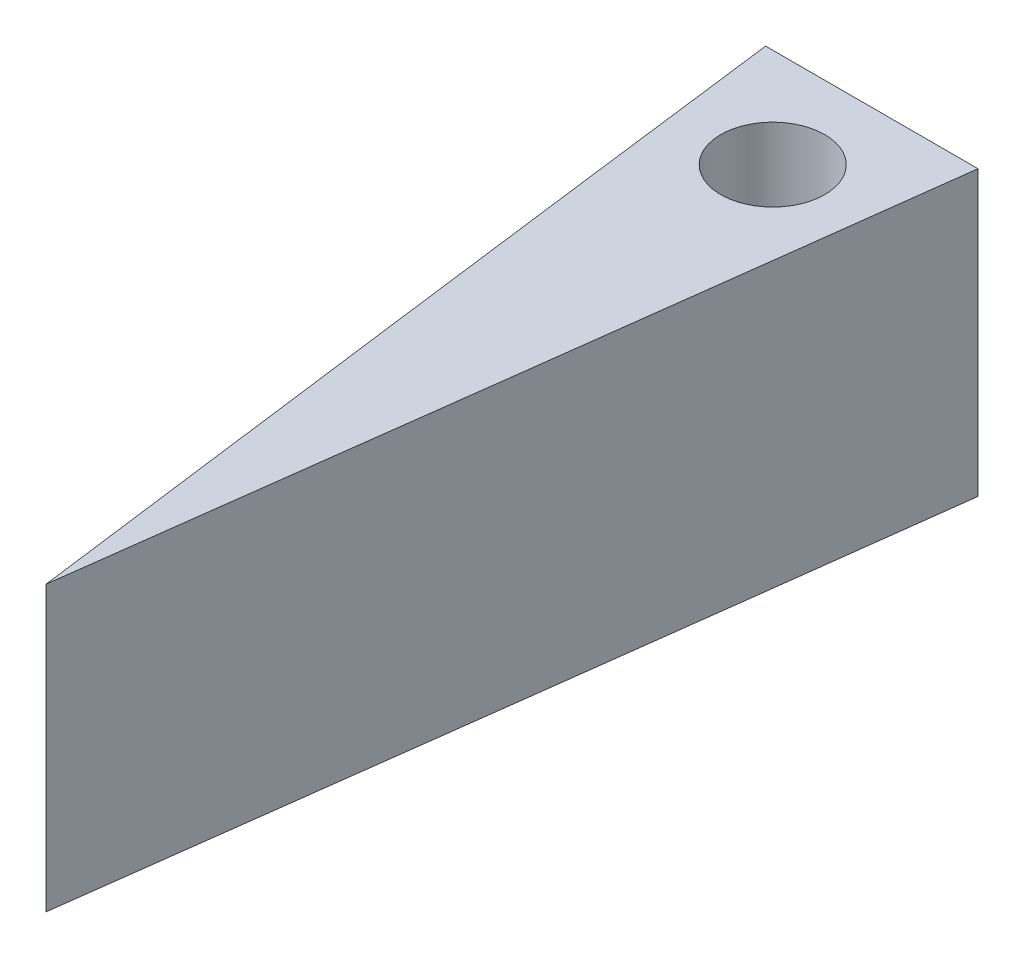
ISO-10303-21;
HEADER;
FILE_DESCRIPTION(('STEP AP214'),'2;1');
FILE_NAME('part.step','',(''),(''),'','','');
FILE_SCHEMA(('AUTOMOTIVE_DESIGN { 1 0 10303 214 1 1 1 1 }'));
ENDSEC;
DATA;
#1=APPLICATION_CONTEXT('core data for automotive mechanical design processes');
#2=APPLICATION_PROTOCOL_DEFINITION('international standard','automotive_design',2000,#1);
#3=PRODUCT_CONTEXT('',#1,'mechanical');
#4=PRODUCT('Part','Part','',(#3));
#5=PRODUCT_RELATED_PRODUCT_CATEGORY('part','',(#4));
#6=PRODUCT_DEFINITION_FORMATION('','',#4);
#7=PRODUCT_DEFINITION_CONTEXT('part definition',#1,'design');
#8=PRODUCT_DEFINITION('design','',#6,#7);
#9=PRODUCT_DEFINITION_SHAPE('','',#8);
#10=(LENGTH_UNIT() NAMED_UNIT(*) SI_UNIT(.MILLI.,.METRE.));
#11=(NAMED_UNIT(*) PLANE_ANGLE_UNIT() SI_UNIT($,.RADIAN.));
#12=(NAMED_UNIT(*) SI_UNIT($,.STERADIAN.) SOLID_ANGLE_UNIT());
#13=UNCERTAINTY_MEASURE_WITH_UNIT(LENGTH_MEASURE(1.E-05),#10,'distance_accuracy_value','');
#14=(GEOMETRIC_REPRESENTATION_CONTEXT(3) GLOBAL_UNCERTAINTY_ASSIGNED_CONTEXT((#13)) GLOBAL_UNIT_ASSIGNED_CONTEXT((#10,
#11,#12)) REPRESENTATION_CONTEXT('',''));
#15=CARTESIAN_POINT('',(0.,0.,0.));
#16=DIRECTION('',(0.,0.,1.));
#17=DIRECTION('',(1.,0.,0.));
#18=AXIS2_PLACEMENT_3D('',#15,#16,#17);
#19=CARTESIAN_POINT('',(1.10809611059364,169.87266,71.9337783562964));
#20=DIRECTION('',(0.,-1.,0.));
#21=DIRECTION('',(0.,0.,-1.));
#22=AXIS2_PLACEMENT_3D('',#19,#20,#21);
#23=CYLINDRICAL_SURFACE('',#22,2.);
#24=CARTESIAN_POINT('',(1.10809611059364,154.195082355691,71.9337783562964));
#25=DIRECTION('',(0.,1.,0.));
#26=DIRECTION('',(0.,0.,1.));
#27=AXIS2_PLACEMENT_3D('',#24,#25,#26);
#28=CIRCLE('',#27,2.);
#29=CARTESIAN_POINT('',(1.10809611059364,154.195082355691,69.9337783562964));
#30=VERTEX_POINT('',#29);
#31=EDGE_CURVE('E88',#30,#30,#28,.F.);
#32=CARTESIAN_POINT('',(1.10809611059364,165.106922355691,71.9337783562964));
#33=DIRECTION('',(0.,-1.,0.));
#34=DIRECTION('',(0.,0.,-1.));
#35=AXIS2_PLACEMENT_3D('',#32,#33,#34);
#36=CIRCLE('',#35,2.);
#37=CARTESIAN_POINT('',(1.10809611059364,165.106922355691,69.9337783562964));
#38=VERTEX_POINT('',#37);
#39=EDGE_CURVE('E171',#38,#38,#36,.F.);
#40=CARTESIAN_POINT('',(1.10809611059364,154.195082355691,69.9337783562964));
#41=CARTESIAN_POINT('',(1.10809611059364,154.308747355691,69.9337783562964));
#42=CARTESIAN_POINT('',(1.10809611059364,154.422412355691,69.9337783562964));
#43=CARTESIAN_POINT('',(1.10809611059364,154.649742355691,69.9337783562964));
#44=CARTESIAN_POINT('',(1.10809611059364,154.763407355691,69.9337783562964));
#45=CARTESIAN_POINT('',(1.10809611059364,154.990737355691,69.9337783562964));
#46=CARTESIAN_POINT('',(1.10809611059364,155.104402355691,69.9337783562964));
#47=CARTESIAN_POINT('',(1.10809611059364,155.331732355691,69.9337783562964));
#48=CARTESIAN_POINT('',(1.10809611059364,155.445397355691,69.9337783562964));
#49=CARTESIAN_POINT('',(1.10809611059364,155.672727355691,69.9337783562964));
#50=CARTESIAN_POINT('',(1.10809611059364,155.786392355691,69.9337783562964));
#51=CARTESIAN_POINT('',(1.10809611059364,156.013722355691,69.9337783562964));
#52=CARTESIAN_POINT('',(1.10809611059364,156.127387355691,69.9337783562964));
#53=CARTESIAN_POINT('',(1.10809611059364,156.354717355691,69.9337783562964));
#54=CARTESIAN_POINT('',(1.10809611059364,156.468382355691,69.9337783562964));
#55=CARTESIAN_POINT('',(1.10809611059364,156.695712355691,69.9337783562964));
#56=CARTESIAN_POINT('',(1.10809611059364,156.809377355691,69.9337783562964));
#57=CARTESIAN_POINT('',(1.10809611059364,157.036707355691,69.9337783562964));
#58=CARTESIAN_POINT('',(1.10809611059364,157.150372355691,69.9337783562964));
#59=CARTESIAN_POINT('',(1.10809611059364,157.377702355691,69.9337783562964));
#60=CARTESIAN_POINT('',(1.10809611059364,157.491367355691,69.9337783562964));
#61=CARTESIAN_POINT('',(1.10809611059364,157.718697355691,69.9337783562964));
#62=CARTESIAN_POINT('',(1.10809611059364,157.832362355691,69.9337783562964));
#63=CARTESIAN_POINT('',(1.10809611059364,158.059692355691,69.9337783562964));
#64=CARTESIAN_POINT('',(1.10809611059364,158.173357355691,69.9337783562964));
#65=CARTESIAN_POINT('',(1.10809611059364,158.400687355691,69.9337783562964));
#66=CARTESIAN_POINT('',(1.10809611059364,158.514352355691,69.9337783562964));
#67=CARTESIAN_POINT('',(1.10809611059364,158.741682355691,69.9337783562964));
#68=CARTESIAN_POINT('',(1.10809611059364,158.855347355691,69.9337783562964));
#69=CARTESIAN_POINT('',(1.10809611059364,159.082677355691,69.9337783562964));
#70=CARTESIAN_POINT('',(1.10809611059364,159.196342355691,69.9337783562964));
#71=CARTESIAN_POINT('',(1.10809611059364,159.423672355691,69.9337783562964));
#72=CARTESIAN_POINT('',(1.10809611059364,159.537337355691,69.9337783562964));
#73=CARTESIAN_POINT('',(1.10809611059364,159.764667355691,69.9337783562964));
#74=CARTESIAN_POINT('',(1.10809611059364,159.878332355691,69.9337783562964));
#75=CARTESIAN_POINT('',(1.10809611059364,160.105662355691,69.9337783562964));
#76=CARTESIAN_POINT('',(1.10809611059364,160.219327355691,69.9337783562964));
#77=CARTESIAN_POINT('',(1.10809611059364,160.446657355691,69.9337783562964));
#78=CARTESIAN_POINT('',(1.10809611059364,160.560322355691,69.9337783562964));
#79=CARTESIAN_POINT('',(1.10809611059364,160.787652355691,69.9337783562964));
#80=CARTESIAN_POINT('',(1.10809611059364,160.901317355691,69.9337783562964));
#81=CARTESIAN_POINT('',(1.10809611059364,161.128647355691,69.9337783562964));
#82=CARTESIAN_POINT('',(1.10809611059364,161.242312355691,69.9337783562964));
#83=CARTESIAN_POINT('',(1.10809611059364,161.469642355691,69.9337783562964));
#84=CARTESIAN_POINT('',(1.10809611059364,161.583307355691,69.9337783562964));
#85=CARTESIAN_POINT('',(1.10809611059364,161.810637355691,69.9337783562964));
#86=CARTESIAN_POINT('',(1.10809611059364,161.924302355691,69.9337783562964));
#87=CARTESIAN_POINT('',(1.10809611059364,162.151632355691,69.9337783562964));
#88=CARTESIAN_POINT('',(1.10809611059364,162.265297355691,69.9337783562964));
#89=CARTESIAN_POINT('',(1.10809611059364,162.492627355691,69.9337783562964));
#90=CARTESIAN_POINT('',(1.10809611059364,162.606292355691,69.9337783562964));
#91=CARTESIAN_POINT('',(1.10809611059364,162.833622355691,69.9337783562964));
#92=CARTESIAN_POINT('',(1.10809611059364,162.947287355691,69.9337783562964));
#93=CARTESIAN_POINT('',(1.10809611059364,163.174617355691,69.9337783562964));
#94=CARTESIAN_POINT('',(1.10809611059364,163.288282355691,69.9337783562964));
#95=CARTESIAN_POINT('',(1.10809611059364,163.515612355691,69.9337783562964));
#96=CARTESIAN_POINT('',(1.10809611059364,163.629277355691,69.9337783562964));
#97=CARTESIAN_POINT('',(1.10809611059364,163.856607355691,69.9337783562964));
#98=CARTESIAN_POINT('',(1.10809611059364,163.970272355691,69.9337783562964));
#99=CARTESIAN_POINT('',(1.10809611059364,164.197602355691,69.9337783562964));
#100=CARTESIAN_POINT('',(1.10809611059364,164.311267355691,69.9337783562964));
#101=CARTESIAN_POINT('',(1.10809611059364,164.538597355691,69.9337783562964));
#102=CARTESIAN_POINT('',(1.10809611059364,164.652262355691,69.9337783562964));
#103=CARTESIAN_POINT('',(1.10809611059364,164.879592355691,69.9337783562964));
#104=CARTESIAN_POINT('',(1.10809611059364,164.993257355691,69.9337783562964));
#105=CARTESIAN_POINT('',(1.10809611059364,165.106922355691,69.9337783562964));
#106=B_SPLINE_CURVE_WITH_KNOTS('',3,(#40,#41,#42,#43,#44,#45,#46,#47,#48,#49,#50,#51,#52,#53,
#54,#55,#56,#57,#58,#59,#60,#61,#62,#63,#64,#65,#66,#67,#68,#69,#70,#71,#72,#73,#74,#75,#76,#77,
#78,#79,#80,#81,#82,#83,#84,#85,#86,#87,#88,#89,#90,#91,#92,#93,#94,#95,#96,#97,#98,#99,#100,
#101,#102,#103,#104,#105),.UNSPECIFIED.,.F.,.F.,(4,2,2,2,2,2,2,2,2,2,2,2,2,2,2,2,2,2,2,2,2,2,2,
2,2,2,2,2,2,2,2,2,4),(0.,0.340995000000011,0.681990000000021,1.022985,1.36398000000001,
1.70497500000003,2.04597000000001,2.38696500000002,2.72796000000003,3.06895500000001,
3.40995000000002,3.75094500000003,4.09194000000002,4.43293500000003,4.77393000000004,
5.11492500000002,5.45592000000003,5.79691500000004,6.13791000000002,6.47890500000003,
6.81990000000004,7.16089500000003,7.50189000000004,7.84288500000005,8.18388000000003,
8.52487500000004,8.86587000000005,9.20686500000004,9.54786000000005,9.88885500000006,10.22985,
10.5708450000001,10.9118400000001),.UNSPECIFIED.);
#107=EDGE_CURVE('BSEAM38',#30,#38,#106,.T.);
#108=ORIENTED_EDGE('',*,*,#31,.T.);
#109=ORIENTED_EDGE('',*,*,#39,.T.);
#110=ORIENTED_EDGE('',*,*,#107,.T.);
#111=ORIENTED_EDGE('',*,*,#107,.F.);
#112=EDGE_LOOP('',(#108,#110,#109,#111));
#113=FACE_BOUND('',#112,.T.);
#114=ADVANCED_FACE('F38',(#113),#23,.F.);
#115=CARTESIAN_POINT('',(-9.25951888196291,165.106922355691,99.8737783562964));
#116=DIRECTION('',(0.,-1.,0.));
#117=DIRECTION('',(0.,0.,-1.));
#118=AXIS2_PLACEMENT_3D('',#115,#116,#117);
#119=PLANE('',#118);
#120=CARTESIAN_POINT('',(1.10809611059364,165.106922355691,99.8737783562964));
#121=CARTESIAN_POINT('',(4.52734474351301,165.106922355691,73.5317641629186));
#122=CARTESIAN_POINT('',(7.98655990047842,165.106922355691,47.187219651543));
#123=CARTESIAN_POINT('',(10.6028996496958,165.106922355691,20.7524515728353));
#124=B_SPLINE_CURVE_WITH_KNOTS('',3,(#120,#121,#122,#123),.UNSPECIFIED.,.F.,.F.,(4,4),(0.,
0.384969625903911),.UNSPECIFIED.);
#125=CARTESIAN_POINT('',(5.19054493101613,165.106922355691,68.1237783577466));
#126=VERTEX_POINT('',#125);
#127=CARTESIAN_POINT('',(1.10809611059364,165.106922355691,99.8737783562964));
#128=VERTEX_POINT('',#127);
#129=EDGE_CURVE('E169',#126,#128,#124,.F.);
#130=ORIENTED_EDGE('',*,*,#129,.F.);
#131=DIRECTION('',(-1.,0.,0.));
#132=VECTOR('',#131,1.);
#133=CARTESIAN_POINT('',(-35.7381827274976,165.106922355691,68.1237783562964));
#134=LINE('',#133,#132);
#135=CARTESIAN_POINT('',(-2.97435270982525,165.106922355691,68.1237783562964));
#136=VERTEX_POINT('',#135);
#137=EDGE_CURVE('E55',#126,#136,#134,.T.);
#138=ORIENTED_EDGE('',*,*,#137,.T.);
#139=CARTESIAN_POINT('',(-8.38670742850917,165.106922355691,20.7524515728352));
#140=CARTESIAN_POINT('',(-5.77036767929202,165.106922355691,47.1872196515421));
#141=CARTESIAN_POINT('',(-2.31115252231645,165.106922355691,73.5317641629202));
#142=CARTESIAN_POINT('',(1.10809611059364,165.106922355691,99.8737783562964));
#143=B_SPLINE_CURVE_WITH_KNOTS('',3,(#139,#140,#141,#142),.UNSPECIFIED.,.F.,.F.,(4,4),(0.,
0.384969625903912),.UNSPECIFIED.);
#144=EDGE_CURVE('E94',#128,#136,#143,.F.);
#145=ORIENTED_EDGE('',*,*,#144,.F.);
#146=EDGE_LOOP('',(#130,#138,#145));
#147=FACE_BOUND('',#146,.T.);
#148=ORIENTED_EDGE('',*,*,#39,.F.);
#149=EDGE_LOOP('',(#148));
#150=FACE_BOUND('',#149,.T.);
#151=ADVANCED_FACE('F128',(#147,#150),#119,.F.);
#152=CARTESIAN_POINT('',(-9.25951888196291,154.195082355691,99.8737783562964));
#153=DIRECTION('',(0.,1.,0.));
#154=DIRECTION('',(0.,0.,1.));
#155=AXIS2_PLACEMENT_3D('',#152,#153,#154);
#156=PLANE('',#155);
#157=CARTESIAN_POINT('',(-8.38670742850917,154.195082355691,20.7524515728352));
#158=CARTESIAN_POINT('',(-5.77036767929202,154.195082355691,47.1872196515421));
#159=CARTESIAN_POINT('',(-2.31115252231645,154.195082355691,73.5317641629202));
#160=CARTESIAN_POINT('',(1.10809611059364,154.195082355691,99.8737783562964));
#161=B_SPLINE_CURVE_WITH_KNOTS('',3,(#157,#158,#159,#160),.UNSPECIFIED.,.F.,.F.,(4,4),(0.,
0.384969625903912),.UNSPECIFIED.);
#162=CARTESIAN_POINT('',(-2.97435270982525,154.195082355691,68.1237783562964));
#163=VERTEX_POINT('',#162);
#164=CARTESIAN_POINT('',(1.10809611059364,154.195082355691,99.8737783562964));
#165=VERTEX_POINT('',#164);
#166=EDGE_CURVE('E62',#163,#165,#161,.T.);
#167=ORIENTED_EDGE('',*,*,#166,.F.);
#168=DIRECTION('',(-1.,0.,0.));
#169=VECTOR('',#168,1.);
#170=CARTESIAN_POINT('',(-35.7381827274976,154.195082355691,68.1237783562964));
#171=LINE('',#170,#169);
#172=CARTESIAN_POINT('',(5.19054493101613,154.195082355691,68.1237783562964));
#173=VERTEX_POINT('',#172);
#174=EDGE_CURVE('E75',#173,#163,#171,.T.);
#175=ORIENTED_EDGE('',*,*,#174,.F.);
#176=CARTESIAN_POINT('',(1.10809611059364,154.195082355691,99.8737783562964));
#177=CARTESIAN_POINT('',(4.52734474351301,154.195082355691,73.5317641629186));
#178=CARTESIAN_POINT('',(7.98655990047842,154.195082355691,47.187219651543));
#179=CARTESIAN_POINT('',(10.6028996496958,154.195082355691,20.7524515728353));
#180=B_SPLINE_CURVE_WITH_KNOTS('',3,(#176,#177,#178,#179),.UNSPECIFIED.,.F.,.F.,(4,4),(0.,
0.384969625903911),.UNSPECIFIED.);
#181=EDGE_CURVE('E82',#165,#173,#180,.T.);
#182=ORIENTED_EDGE('',*,*,#181,.F.);
#183=EDGE_LOOP('',(#167,#175,#182));
#184=FACE_BOUND('',#183,.T.);
#185=ORIENTED_EDGE('',*,*,#31,.F.);
#186=EDGE_LOOP('',(#185));
#187=FACE_BOUND('',#186,.T.);
#188=ADVANCED_FACE('F80',(#184,#187),#156,.F.);
#189=CARTESIAN_POINT('',(-8.38670742850917,169.87266,20.7524515728352));
#190=CARTESIAN_POINT('',(-5.77036767929202,169.87266,47.1872196515421));
#191=CARTESIAN_POINT('',(-2.31115252231645,169.87266,73.5317641629202));
#192=CARTESIAN_POINT('',(1.10809611059364,169.87266,99.8737783562964));
#193=B_SPLINE_CURVE_WITH_KNOTS('',3,(#189,#190,#191,#192),.UNSPECIFIED.,.F.,.F.,(4,4),(0.,
0.384969625903912),.UNSPECIFIED.);
#194=DIRECTION('',(0.,-1.,0.));
#195=VECTOR('',#194,1.);
#196=SURFACE_OF_LINEAR_EXTRUSION('',#193,#195);
#197=ORIENTED_EDGE('',*,*,#144,.T.);
#198=DIRECTION('',(0.,-1.,0.));
#199=VECTOR('',#198,1.);
#200=CARTESIAN_POINT('',(-2.97435271000725,159.651002355691,68.1237783562964));
#201=LINE('',#200,#199);
#202=EDGE_CURVE('E167',#136,#163,#201,.T.);
#203=ORIENTED_EDGE('',*,*,#202,.T.);
#204=ORIENTED_EDGE('',*,*,#166,.T.);
#205=DIRECTION('',(0.,-1.,0.));
#206=VECTOR('',#205,1.);
#207=CARTESIAN_POINT('',(1.10809611059364,169.87266,99.8737783562964));
#208=LINE('',#207,#206);
#209=EDGE_CURVE('E48',#128,#165,#208,.T.);
#210=ORIENTED_EDGE('',*,*,#209,.F.);
#211=EDGE_LOOP('',(#197,#203,#204,#210));
#212=FACE_BOUND('',#211,.T.);
#213=ADVANCED_FACE('F40',(#212),#196,.F.);
#214=CARTESIAN_POINT('',(1.10809611059364,169.87266,99.8737783562964));
#215=CARTESIAN_POINT('',(4.52734474351301,169.87266,73.5317641629186));
#216=CARTESIAN_POINT('',(7.98655990047842,169.87266,47.187219651543));
#217=CARTESIAN_POINT('',(10.6028996496958,169.87266,20.7524515728353));
#218=B_SPLINE_CURVE_WITH_KNOTS('',3,(#214,#215,#216,#217),.UNSPECIFIED.,.F.,.F.,(4,4),(0.,
0.384969625903911),.UNSPECIFIED.);
#219=DIRECTION('',(0.,-1.,0.));
#220=VECTOR('',#219,1.);
#221=SURFACE_OF_LINEAR_EXTRUSION('',#218,#220);
#222=ORIENTED_EDGE('',*,*,#181,.T.);
#223=DIRECTION('',(0.,-1.,0.));
#224=VECTOR('',#223,1.);
#225=CARTESIAN_POINT('',(5.19054493119819,159.651002355691,68.1237783562964));
#226=LINE('',#225,#224);
#227=EDGE_CURVE('E11',#173,#126,#226,.F.);
#228=ORIENTED_EDGE('',*,*,#227,.T.);
#229=ORIENTED_EDGE('',*,*,#129,.T.);
#230=ORIENTED_EDGE('',*,*,#209,.T.);
#231=EDGE_LOOP('',(#222,#228,#229,#230));
#232=FACE_BOUND('',#231,.T.);
#233=ADVANCED_FACE('F86',(#232),#221,.F.);
#234=CARTESIAN_POINT('',(-35.7381827274976,165.106922355691,68.1237783562964));
#235=DIRECTION('',(0.,0.,1.));
#236=DIRECTION('',(1.,0.,0.));
#237=AXIS2_PLACEMENT_3D('',#234,#235,#236);
#238=PLANE('',#237);
#239=ORIENTED_EDGE('',*,*,#137,.F.);
#240=ORIENTED_EDGE('',*,*,#227,.F.);
#241=ORIENTED_EDGE('',*,*,#174,.T.);
#242=ORIENTED_EDGE('',*,*,#202,.F.);
#243=EDGE_LOOP('',(#239,#240,#241,#242));
#244=FACE_BOUND('',#243,.T.);
#245=ADVANCED_FACE('F74',(#244),#238,.F.);
#246=CLOSED_SHELL('',(#114,#151,#188,#213,#233,#245));
#247=MANIFOLD_SOLID_BREP('B2',#246);
#248=ADVANCED_BREP_SHAPE_REPRESENTATION('',(#18,#247),#14);
#249=SHAPE_DEFINITION_REPRESENTATION(#9,#248);
ENDSEC;
END-ISO-10303-21;
